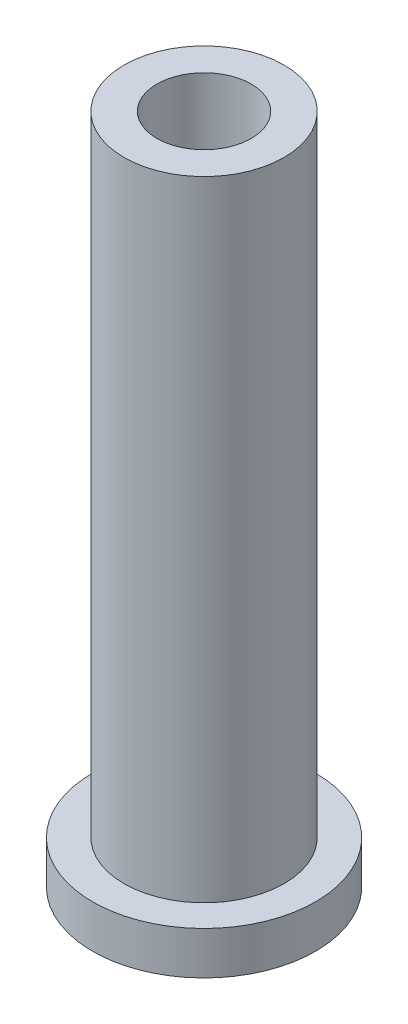
ISO-10303-21;
HEADER;
FILE_DESCRIPTION(('STEP AP214'),'2;1');
FILE_NAME('part.step','',(''),(''),'','','');
FILE_SCHEMA(('AUTOMOTIVE_DESIGN { 1 0 10303 214 1 1 1 1 }'));
ENDSEC;
DATA;
#1=APPLICATION_CONTEXT('core data for automotive mechanical design processes');
#2=APPLICATION_PROTOCOL_DEFINITION('international standard','automotive_design',2000,#1);
#3=PRODUCT_CONTEXT('',#1,'mechanical');
#4=PRODUCT('Part','Part','',(#3));
#5=PRODUCT_RELATED_PRODUCT_CATEGORY('part','',(#4));
#6=PRODUCT_DEFINITION_FORMATION('','',#4);
#7=PRODUCT_DEFINITION_CONTEXT('part definition',#1,'design');
#8=PRODUCT_DEFINITION('design','',#6,#7);
#9=PRODUCT_DEFINITION_SHAPE('','',#8);
#10=(LENGTH_UNIT() NAMED_UNIT(*) SI_UNIT(.MILLI.,.METRE.));
#11=(NAMED_UNIT(*) PLANE_ANGLE_UNIT() SI_UNIT($,.RADIAN.));
#12=(NAMED_UNIT(*) SI_UNIT($,.STERADIAN.) SOLID_ANGLE_UNIT());
#13=UNCERTAINTY_MEASURE_WITH_UNIT(LENGTH_MEASURE(1.E-05),#10,'distance_accuracy_value','');
#14=(GEOMETRIC_REPRESENTATION_CONTEXT(3) GLOBAL_UNCERTAINTY_ASSIGNED_CONTEXT((#13)) GLOBAL_UNIT_ASSIGNED_CONTEXT((#10,
#11,#12)) REPRESENTATION_CONTEXT('',''));
#15=CARTESIAN_POINT('',(0.,0.,0.));
#16=DIRECTION('',(0.,0.,1.));
#17=DIRECTION('',(1.,0.,0.));
#18=AXIS2_PLACEMENT_3D('',#15,#16,#17);
#19=CARTESIAN_POINT('',(3.9,-1.5,0.));
#20=DIRECTION('',(0.,-1.,0.));
#21=DIRECTION('',(0.,0.,-1.));
#22=AXIS2_PLACEMENT_3D('',#19,#20,#21);
#23=PLANE('',#22);
#24=CARTESIAN_POINT('',(0.,-1.5,0.));
#25=DIRECTION('',(0.,-1.,0.));
#26=DIRECTION('',(0.,0.,-1.));
#27=AXIS2_PLACEMENT_3D('',#24,#25,#26);
#28=CIRCLE('',#27,3.9);
#29=CARTESIAN_POINT('',(0.,-1.5,-3.9));
#30=VERTEX_POINT('',#29);
#31=EDGE_CURVE('E57',#30,#30,#28,.T.);
#32=ORIENTED_EDGE('',*,*,#31,.T.);
#33=EDGE_LOOP('',(#32));
#34=FACE_BOUND('',#33,.T.);
#35=CARTESIAN_POINT('',(0.,-1.5,0.));
#36=DIRECTION('',(0.,-1.,0.));
#37=DIRECTION('',(0.,0.,-1.));
#38=AXIS2_PLACEMENT_3D('',#35,#36,#37);
#39=CIRCLE('',#38,1.65);
#40=CARTESIAN_POINT('',(0.,-1.5,-1.65));
#41=VERTEX_POINT('',#40);
#42=EDGE_CURVE('E10',#41,#41,#39,.T.);
#43=ORIENTED_EDGE('',*,*,#42,.F.);
#44=EDGE_LOOP('',(#43));
#45=FACE_BOUND('',#44,.T.);
#46=ADVANCED_FACE('F35',(#34,#45),#23,.T.);
#47=CARTESIAN_POINT('',(0.,-500.,0.));
#48=DIRECTION('',(0.,-1.,0.));
#49=DIRECTION('',(0.,0.,-1.));
#50=AXIS2_PLACEMENT_3D('',#47,#48,#49);
#51=CYLINDRICAL_SURFACE('',#50,1.65);
#52=ORIENTED_EDGE('',*,*,#42,.T.);
#53=EDGE_LOOP('',(#52));
#54=FACE_BOUND('',#53,.T.);
#55=CARTESIAN_POINT('',(0.,22.,0.));
#56=DIRECTION('',(0.,-1.,0.));
#57=DIRECTION('',(0.,0.,-1.));
#58=AXIS2_PLACEMENT_3D('',#55,#56,#57);
#59=CIRCLE('',#58,1.65);
#60=CARTESIAN_POINT('',(0.,22.,-1.65));
#61=VERTEX_POINT('',#60);
#62=EDGE_CURVE('E41',#61,#61,#59,.T.);
#63=ORIENTED_EDGE('',*,*,#62,.F.);
#64=EDGE_LOOP('',(#63));
#65=FACE_BOUND('',#64,.T.);
#66=ADVANCED_FACE('F75',(#54,#65),#51,.F.);
#67=CARTESIAN_POINT('',(1.65,22.,0.));
#68=DIRECTION('',(0.,1.,0.));
#69=DIRECTION('',(0.,0.,1.));
#70=AXIS2_PLACEMENT_3D('',#67,#68,#69);
#71=PLANE('',#70);
#72=ORIENTED_EDGE('',*,*,#62,.T.);
#73=EDGE_LOOP('',(#72));
#74=FACE_BOUND('',#73,.T.);
#75=CARTESIAN_POINT('',(0.,22.,0.));
#76=DIRECTION('',(0.,-1.,0.));
#77=DIRECTION('',(0.,0.,-1.));
#78=AXIS2_PLACEMENT_3D('',#75,#76,#77);
#79=CIRCLE('',#78,2.8);
#80=CARTESIAN_POINT('',(0.,22.,-2.8));
#81=VERTEX_POINT('',#80);
#82=EDGE_CURVE('E45',#81,#81,#79,.T.);
#83=ORIENTED_EDGE('',*,*,#82,.F.);
#84=EDGE_LOOP('',(#83));
#85=FACE_BOUND('',#84,.T.);
#86=ADVANCED_FACE('F79',(#74,#85),#71,.T.);
#87=CARTESIAN_POINT('',(0.,-500.,0.));
#88=DIRECTION('',(0.,-1.,0.));
#89=DIRECTION('',(0.,0.,-1.));
#90=AXIS2_PLACEMENT_3D('',#87,#88,#89);
#91=CYLINDRICAL_SURFACE('',#90,2.8);
#92=ORIENTED_EDGE('',*,*,#82,.T.);
#93=EDGE_LOOP('',(#92));
#94=FACE_BOUND('',#93,.T.);
#95=CARTESIAN_POINT('',(0.,0.,0.));
#96=DIRECTION('',(0.,-1.,0.));
#97=DIRECTION('',(0.,0.,-1.));
#98=AXIS2_PLACEMENT_3D('',#95,#96,#97);
#99=CIRCLE('',#98,2.8);
#100=CARTESIAN_POINT('',(0.,0.,-2.8));
#101=VERTEX_POINT('',#100);
#102=EDGE_CURVE('E49',#101,#101,#99,.T.);
#103=ORIENTED_EDGE('',*,*,#102,.F.);
#104=EDGE_LOOP('',(#103));
#105=FACE_BOUND('',#104,.T.);
#106=ADVANCED_FACE('F71',(#94,#105),#91,.T.);
#107=CARTESIAN_POINT('',(2.8,0.,0.));
#108=DIRECTION('',(0.,1.,0.));
#109=DIRECTION('',(0.,0.,1.));
#110=AXIS2_PLACEMENT_3D('',#107,#108,#109);
#111=PLANE('',#110);
#112=ORIENTED_EDGE('',*,*,#102,.T.);
#113=EDGE_LOOP('',(#112));
#114=FACE_BOUND('',#113,.T.);
#115=CARTESIAN_POINT('',(0.,0.,0.));
#116=DIRECTION('',(0.,-1.,0.));
#117=DIRECTION('',(0.,0.,-1.));
#118=AXIS2_PLACEMENT_3D('',#115,#116,#117);
#119=CIRCLE('',#118,3.9);
#120=CARTESIAN_POINT('',(0.,0.,-3.9));
#121=VERTEX_POINT('',#120);
#122=EDGE_CURVE('E54',#121,#121,#119,.T.);
#123=ORIENTED_EDGE('',*,*,#122,.F.);
#124=EDGE_LOOP('',(#123));
#125=FACE_BOUND('',#124,.T.);
#126=ADVANCED_FACE('F65',(#114,#125),#111,.T.);
#127=CARTESIAN_POINT('',(0.,-500.,0.));
#128=DIRECTION('',(0.,-1.,0.));
#129=DIRECTION('',(0.,0.,-1.));
#130=AXIS2_PLACEMENT_3D('',#127,#128,#129);
#131=CYLINDRICAL_SURFACE('',#130,3.9);
#132=ORIENTED_EDGE('',*,*,#122,.T.);
#133=EDGE_LOOP('',(#132));
#134=FACE_BOUND('',#133,.T.);
#135=ORIENTED_EDGE('',*,*,#31,.F.);
#136=EDGE_LOOP('',(#135));
#137=FACE_BOUND('',#136,.T.);
#138=ADVANCED_FACE('F63',(#134,#137),#131,.T.);
#139=CLOSED_SHELL('',(#46,#66,#86,#106,#126,#138));
#140=MANIFOLD_SOLID_BREP('B2',#139);
#141=ADVANCED_BREP_SHAPE_REPRESENTATION('',(#18,#140),#14);
#142=SHAPE_DEFINITION_REPRESENTATION(#9,#141);
ENDSEC;
END-ISO-10303-21;
